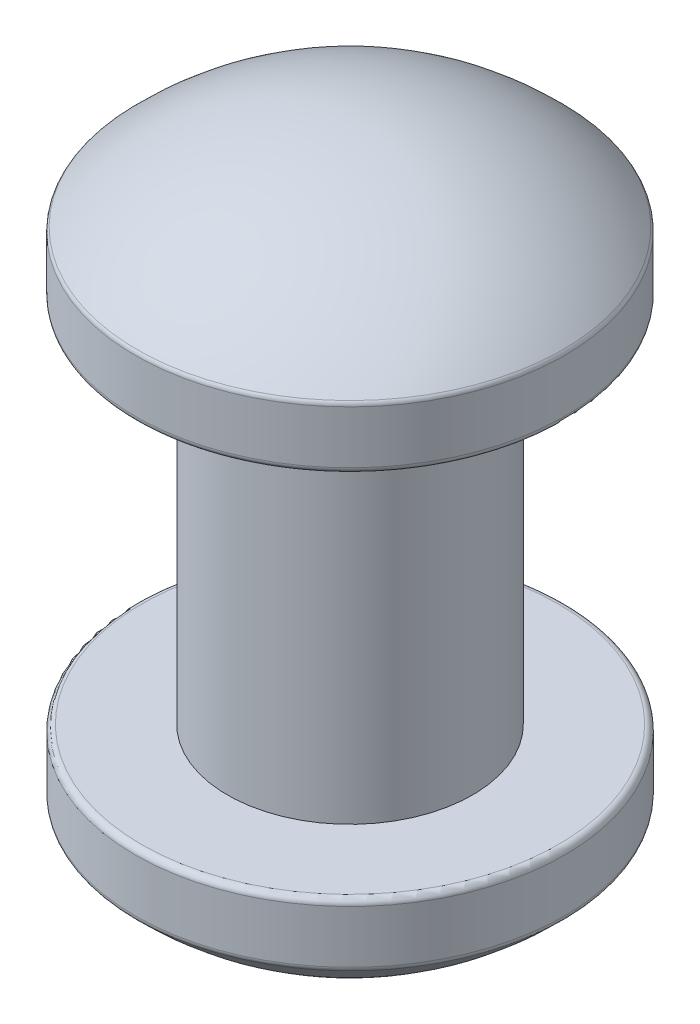
ISO-10303-21;
HEADER;
FILE_DESCRIPTION(('STEP AP214'),'2;1');
FILE_NAME('part.step','',(''),(''),'','','');
FILE_SCHEMA(('AUTOMOTIVE_DESIGN { 1 0 10303 214 1 1 1 1 }'));
ENDSEC;
DATA;
#1=APPLICATION_CONTEXT('core data for automotive mechanical design processes');
#2=APPLICATION_PROTOCOL_DEFINITION('international standard','automotive_design',2000,#1);
#3=PRODUCT_CONTEXT('',#1,'mechanical');
#4=PRODUCT('Part','Part','',(#3));
#5=PRODUCT_RELATED_PRODUCT_CATEGORY('part','',(#4));
#6=PRODUCT_DEFINITION_FORMATION('','',#4);
#7=PRODUCT_DEFINITION_CONTEXT('part definition',#1,'design');
#8=PRODUCT_DEFINITION('design','',#6,#7);
#9=PRODUCT_DEFINITION_SHAPE('','',#8);
#10=(LENGTH_UNIT() NAMED_UNIT(*) SI_UNIT(.MILLI.,.METRE.));
#11=(NAMED_UNIT(*) PLANE_ANGLE_UNIT() SI_UNIT($,.RADIAN.));
#12=(NAMED_UNIT(*) SI_UNIT($,.STERADIAN.) SOLID_ANGLE_UNIT());
#13=UNCERTAINTY_MEASURE_WITH_UNIT(LENGTH_MEASURE(1.E-05),#10,'distance_accuracy_value','');
#14=(GEOMETRIC_REPRESENTATION_CONTEXT(3) GLOBAL_UNCERTAINTY_ASSIGNED_CONTEXT((#13)) GLOBAL_UNIT_ASSIGNED_CONTEXT((#10,
#11,#12)) REPRESENTATION_CONTEXT('',''));
#15=CARTESIAN_POINT('',(0.,0.,0.));
#16=DIRECTION('',(0.,0.,1.));
#17=DIRECTION('',(1.,0.,0.));
#18=AXIS2_PLACEMENT_3D('',#15,#16,#17);
#19=CARTESIAN_POINT('',(0.,0.0666666666666668,0.));
#20=DIRECTION('',(0.,0.,1.));
#21=DIRECTION('',(1.,0.,0.));
#22=AXIS2_PLACEMENT_3D('',#19,#20,#21);
#23=SPHERICAL_SURFACE('',#22,0.483333333333333);
#24=CARTESIAN_POINT('',(0.,0.0666666666666668,0.));
#25=DIRECTION('',(0.,-1.,0.));
#26=DIRECTION('',(0.,0.,-1.));
#27=AXIS2_PLACEMENT_3D('',#24,#25,#26);
#28=SPHERICAL_SURFACE('',#27,0.483333333333333);
#29=CARTESIAN_POINT('',(0.,0.402932940865376,0.));
#30=DIRECTION('',(0.,-1.,0.));
#31=DIRECTION('',(0.,0.,-1.));
#32=AXIS2_PLACEMENT_3D('',#29,#30,#31);
#33=CIRCLE('',#32,0.347183098591549);
#34=CARTESIAN_POINT('',(0.,0.402932940865376,-0.347183098591549));
#35=VERTEX_POINT('',#34);
#36=EDGE_CURVE('E10',#35,#35,#33,.F.);
#37=ORIENTED_EDGE('',*,*,#36,.T.);
#38=EDGE_LOOP('',(#37));
#39=FACE_BOUND('',#38,.T.);
#40=ADVANCED_FACE('F39',(#39),#28,.T.);
#41=CARTESIAN_POINT('',(0.,-0.4,0.));
#42=DIRECTION('',(0.,-1.,0.));
#43=DIRECTION('',(0.,0.,-1.));
#44=AXIS2_PLACEMENT_3D('',#41,#42,#43);
#45=CYLINDRICAL_SURFACE('',#44,0.35);
#46=CARTESIAN_POINT('',(0.,0.31,0.));
#47=DIRECTION('',(0.,-1.,0.));
#48=DIRECTION('',(0.,0.,-1.));
#49=AXIS2_PLACEMENT_3D('',#46,#47,#48);
#50=CIRCLE('',#49,0.35);
#51=CARTESIAN_POINT('',(0.,0.31,-0.35));
#52=VERTEX_POINT('',#51);
#53=EDGE_CURVE('E47',#52,#52,#50,.F.);
#54=ORIENTED_EDGE('',*,*,#53,.T.);
#55=EDGE_LOOP('',(#54));
#56=FACE_BOUND('',#55,.T.);
#57=CARTESIAN_POINT('',(0.,0.395975707606093,0.));
#58=DIRECTION('',(0.,-1.,0.));
#59=DIRECTION('',(0.,0.,-1.));
#60=AXIS2_PLACEMENT_3D('',#57,#58,#59);
#61=CIRCLE('',#60,0.35);
#62=CARTESIAN_POINT('',(0.,0.395975707606093,-0.35));
#63=VERTEX_POINT('',#62);
#64=EDGE_CURVE('E52',#63,#63,#61,.T.);
#65=ORIENTED_EDGE('',*,*,#64,.T.);
#66=EDGE_LOOP('',(#65));
#67=FACE_BOUND('',#66,.T.);
#68=ADVANCED_FACE('F102',(#56,#67),#45,.T.);
#69=CARTESIAN_POINT('',(0.35,0.3,0.));
#70=DIRECTION('',(0.,-1.,0.));
#71=DIRECTION('',(0.,0.,-1.));
#72=AXIS2_PLACEMENT_3D('',#69,#70,#71);
#73=PLANE('',#72);
#74=CARTESIAN_POINT('',(0.,0.3,0.));
#75=DIRECTION('',(0.,-1.,0.));
#76=DIRECTION('',(0.,0.,-1.));
#77=AXIS2_PLACEMENT_3D('',#74,#75,#76);
#78=CIRCLE('',#77,0.34);
#79=CARTESIAN_POINT('',(0.,0.3,-0.34));
#80=VERTEX_POINT('',#79);
#81=EDGE_CURVE('E57',#80,#80,#78,.T.);
#82=ORIENTED_EDGE('',*,*,#81,.T.);
#83=EDGE_LOOP('',(#82));
#84=FACE_BOUND('',#83,.T.);
#85=CARTESIAN_POINT('',(0.,0.3,0.));
#86=DIRECTION('',(0.,-1.,0.));
#87=DIRECTION('',(0.,0.,-1.));
#88=AXIS2_PLACEMENT_3D('',#85,#86,#87);
#89=CIRCLE('',#88,0.2);
#90=CARTESIAN_POINT('',(0.,0.3,-0.2));
#91=VERTEX_POINT('',#90);
#92=EDGE_CURVE('E79',#91,#91,#89,.T.);
#93=ORIENTED_EDGE('',*,*,#92,.F.);
#94=EDGE_LOOP('',(#93));
#95=FACE_BOUND('',#94,.T.);
#96=ADVANCED_FACE('F92',(#84,#95),#73,.T.);
#97=CARTESIAN_POINT('',(0.,-0.4,0.));
#98=DIRECTION('',(0.,-1.,0.));
#99=DIRECTION('',(0.,0.,-1.));
#100=AXIS2_PLACEMENT_3D('',#97,#98,#99);
#101=CYLINDRICAL_SURFACE('',#100,0.2);
#102=ORIENTED_EDGE('',*,*,#92,.T.);
#103=EDGE_LOOP('',(#102));
#104=FACE_BOUND('',#103,.T.);
#105=CARTESIAN_POINT('',(0.,-0.3,0.));
#106=DIRECTION('',(0.,-1.,0.));
#107=DIRECTION('',(0.,0.,-1.));
#108=AXIS2_PLACEMENT_3D('',#105,#106,#107);
#109=CIRCLE('',#108,0.2);
#110=CARTESIAN_POINT('',(0.,-0.3,-0.2));
#111=VERTEX_POINT('',#110);
#112=EDGE_CURVE('E83',#111,#111,#109,.T.);
#113=ORIENTED_EDGE('',*,*,#112,.F.);
#114=EDGE_LOOP('',(#113));
#115=FACE_BOUND('',#114,.T.);
#116=ADVANCED_FACE('F90',(#104,#115),#101,.T.);
#117=CARTESIAN_POINT('',(0.35,-0.3,0.));
#118=DIRECTION('',(0.,1.,0.));
#119=DIRECTION('',(0.,0.,1.));
#120=AXIS2_PLACEMENT_3D('',#117,#118,#119);
#121=PLANE('',#120);
#122=CARTESIAN_POINT('',(0.,-0.3,0.));
#123=DIRECTION('',(0.,1.,0.));
#124=DIRECTION('',(0.,0.,1.));
#125=AXIS2_PLACEMENT_3D('',#122,#123,#124);
#126=CIRCLE('',#125,0.34);
#127=CARTESIAN_POINT('',(0.,-0.3,0.34));
#128=VERTEX_POINT('',#127);
#129=EDGE_CURVE('E63',#128,#128,#126,.T.);
#130=ORIENTED_EDGE('',*,*,#129,.T.);
#131=EDGE_LOOP('',(#130));
#132=FACE_BOUND('',#131,.T.);
#133=ORIENTED_EDGE('',*,*,#112,.T.);
#134=EDGE_LOOP('',(#133));
#135=FACE_BOUND('',#134,.T.);
#136=ADVANCED_FACE('F88',(#132,#135),#121,.T.);
#137=CARTESIAN_POINT('',(0.,-0.4,0.));
#138=DIRECTION('',(0.,-1.,0.));
#139=DIRECTION('',(0.,0.,-1.));
#140=AXIS2_PLACEMENT_3D('',#137,#138,#139);
#141=CYLINDRICAL_SURFACE('',#140,0.35);
#142=CARTESIAN_POINT('',(0.,-0.395975707606093,0.));
#143=DIRECTION('',(0.,1.,0.));
#144=DIRECTION('',(0.,0.,1.));
#145=AXIS2_PLACEMENT_3D('',#142,#143,#144);
#146=CIRCLE('',#145,0.35);
#147=CARTESIAN_POINT('',(0.,-0.395975707606093,0.35));
#148=VERTEX_POINT('',#147);
#149=EDGE_CURVE('E67',#148,#148,#146,.T.);
#150=ORIENTED_EDGE('',*,*,#149,.T.);
#151=EDGE_LOOP('',(#150));
#152=FACE_BOUND('',#151,.T.);
#153=CARTESIAN_POINT('',(0.,-0.31,0.));
#154=DIRECTION('',(0.,1.,0.));
#155=DIRECTION('',(0.,0.,1.));
#156=AXIS2_PLACEMENT_3D('',#153,#154,#155);
#157=CIRCLE('',#156,0.35);
#158=CARTESIAN_POINT('',(0.,-0.31,0.35));
#159=VERTEX_POINT('',#158);
#160=EDGE_CURVE('E71',#159,#159,#157,.F.);
#161=ORIENTED_EDGE('',*,*,#160,.T.);
#162=EDGE_LOOP('',(#161));
#163=FACE_BOUND('',#162,.T.);
#164=ADVANCED_FACE('F99',(#152,#163),#141,.T.);
#165=CARTESIAN_POINT('',(0.,-0.0666666666666668,0.));
#166=DIRECTION('',(0.,0.,1.));
#167=DIRECTION('',(1.,0.,0.));
#168=AXIS2_PLACEMENT_3D('',#165,#166,#167);
#169=SPHERICAL_SURFACE('',#168,0.483333333333333);
#170=CARTESIAN_POINT('',(0.,-0.0666666666666668,0.));
#171=DIRECTION('',(0.,1.,0.));
#172=DIRECTION('',(0.,0.,1.));
#173=AXIS2_PLACEMENT_3D('',#170,#171,#172);
#174=SPHERICAL_SURFACE('',#173,0.483333333333333);
#175=CARTESIAN_POINT('',(0.,-0.402932940865376,0.));
#176=DIRECTION('',(0.,1.,0.));
#177=DIRECTION('',(0.,0.,1.));
#178=AXIS2_PLACEMENT_3D('',#175,#176,#177);
#179=CIRCLE('',#178,0.347183098591549);
#180=CARTESIAN_POINT('',(0.,-0.402932940865376,0.347183098591549));
#181=VERTEX_POINT('',#180);
#182=EDGE_CURVE('E75',#181,#181,#179,.F.);
#183=ORIENTED_EDGE('',*,*,#182,.T.);
#184=EDGE_LOOP('',(#183));
#185=FACE_BOUND('',#184,.T.);
#186=ADVANCED_FACE('F112',(#185),#174,.T.);
#187=CARTESIAN_POINT('',(0.,-0.395975707606093,0.));
#188=DIRECTION('',(0.,1.,0.));
#189=DIRECTION('',(0.,0.,1.));
#190=AXIS2_PLACEMENT_3D('',#187,#188,#189);
#191=TOROIDAL_SURFACE('',#190,0.34,0.01);
#192=ORIENTED_EDGE('',*,*,#149,.F.);
#193=EDGE_LOOP('',(#192));
#194=FACE_BOUND('',#193,.T.);
#195=ORIENTED_EDGE('',*,*,#182,.F.);
#196=EDGE_LOOP('',(#195));
#197=FACE_BOUND('',#196,.T.);
#198=ADVANCED_FACE('F115',(#194,#197),#191,.T.);
#199=CARTESIAN_POINT('',(0.,-0.31,0.));
#200=DIRECTION('',(0.,1.,0.));
#201=DIRECTION('',(0.,0.,1.));
#202=AXIS2_PLACEMENT_3D('',#199,#200,#201);
#203=TOROIDAL_SURFACE('',#202,0.34,0.01);
#204=ORIENTED_EDGE('',*,*,#129,.F.);
#205=EDGE_LOOP('',(#204));
#206=FACE_BOUND('',#205,.T.);
#207=ORIENTED_EDGE('',*,*,#160,.F.);
#208=EDGE_LOOP('',(#207));
#209=FACE_BOUND('',#208,.T.);
#210=ADVANCED_FACE('F119',(#206,#209),#203,.T.);
#211=CARTESIAN_POINT('',(0.,0.31,0.));
#212=DIRECTION('',(0.,-1.,0.));
#213=DIRECTION('',(0.,0.,-1.));
#214=AXIS2_PLACEMENT_3D('',#211,#212,#213);
#215=TOROIDAL_SURFACE('',#214,0.34,0.01);
#216=ORIENTED_EDGE('',*,*,#53,.F.);
#217=EDGE_LOOP('',(#216));
#218=FACE_BOUND('',#217,.T.);
#219=ORIENTED_EDGE('',*,*,#81,.F.);
#220=EDGE_LOOP('',(#219));
#221=FACE_BOUND('',#220,.T.);
#222=ADVANCED_FACE('F122',(#218,#221),#215,.T.);
#223=CARTESIAN_POINT('',(0.,0.395975707606093,0.));
#224=DIRECTION('',(0.,-1.,0.));
#225=DIRECTION('',(0.,0.,-1.));
#226=AXIS2_PLACEMENT_3D('',#223,#224,#225);
#227=TOROIDAL_SURFACE('',#226,0.34,0.01);
#228=ORIENTED_EDGE('',*,*,#36,.F.);
#229=EDGE_LOOP('',(#228));
#230=FACE_BOUND('',#229,.T.);
#231=ORIENTED_EDGE('',*,*,#64,.F.);
#232=EDGE_LOOP('',(#231));
#233=FACE_BOUND('',#232,.T.);
#234=ADVANCED_FACE('F41',(#230,#233),#227,.T.);
#235=CLOSED_SHELL('',(#40,#68,#96,#116,#136,#164,#186,#198,#210,#222,#234));
#236=MANIFOLD_SOLID_BREP('B2',#235);
#237=ADVANCED_BREP_SHAPE_REPRESENTATION('',(#18,#236),#14);
#238=SHAPE_DEFINITION_REPRESENTATION(#9,#237);
ENDSEC;
END-ISO-10303-21;
